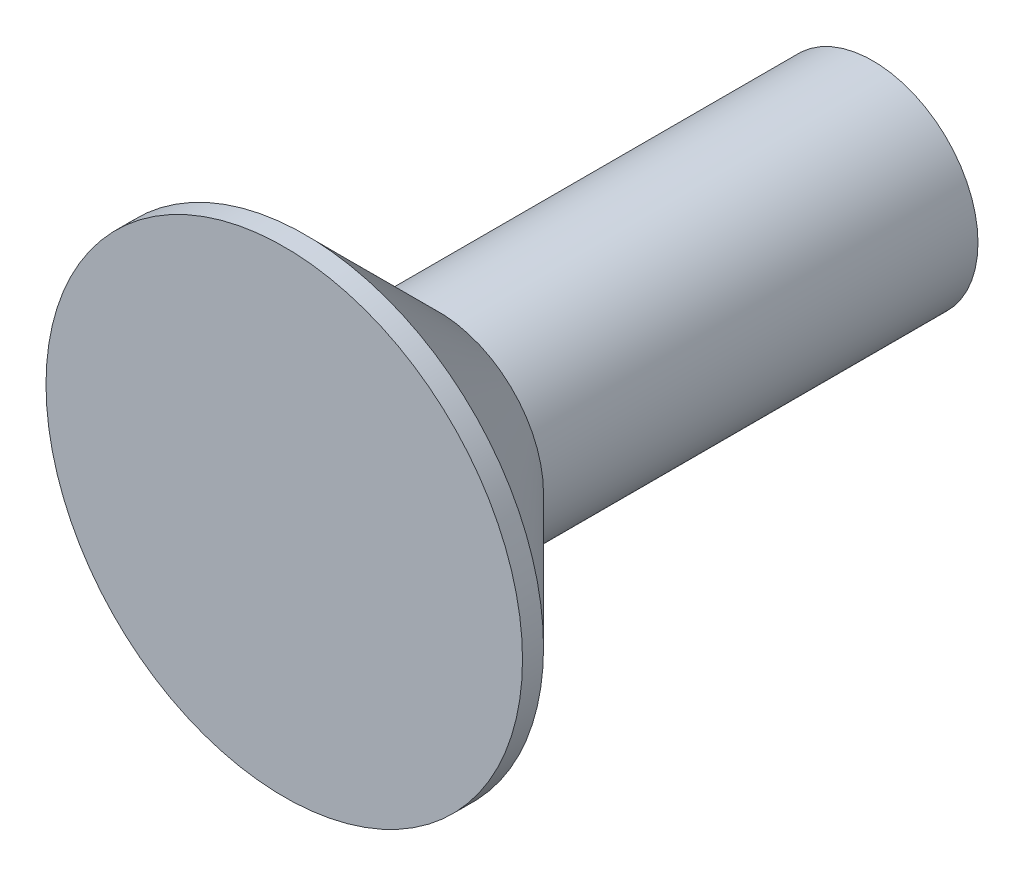
ISO-10303-21;
HEADER;
FILE_DESCRIPTION(('STEP AP214'),'2;1');
FILE_NAME('part.step','',(''),(''),'','','');
FILE_SCHEMA(('AUTOMOTIVE_DESIGN { 1 0 10303 214 1 1 1 1 }'));
ENDSEC;
DATA;
#1=APPLICATION_CONTEXT('core data for automotive mechanical design processes');
#2=APPLICATION_PROTOCOL_DEFINITION('international standard','automotive_design',2000,#1);
#3=PRODUCT_CONTEXT('',#1,'mechanical');
#4=PRODUCT('Part','Part','',(#3));
#5=PRODUCT_RELATED_PRODUCT_CATEGORY('part','',(#4));
#6=PRODUCT_DEFINITION_FORMATION('','',#4);
#7=PRODUCT_DEFINITION_CONTEXT('part definition',#1,'design');
#8=PRODUCT_DEFINITION('design','',#6,#7);
#9=PRODUCT_DEFINITION_SHAPE('','',#8);
#10=(LENGTH_UNIT() NAMED_UNIT(*) SI_UNIT(.MILLI.,.METRE.));
#11=(NAMED_UNIT(*) PLANE_ANGLE_UNIT() SI_UNIT($,.RADIAN.));
#12=(NAMED_UNIT(*) SI_UNIT($,.STERADIAN.) SOLID_ANGLE_UNIT());
#13=UNCERTAINTY_MEASURE_WITH_UNIT(LENGTH_MEASURE(1.E-05),#10,'distance_accuracy_value','');
#14=(GEOMETRIC_REPRESENTATION_CONTEXT(3) GLOBAL_UNCERTAINTY_ASSIGNED_CONTEXT((#13)) GLOBAL_UNIT_ASSIGNED_CONTEXT((#10,
#11,#12)) REPRESENTATION_CONTEXT('',''));
#15=CARTESIAN_POINT('',(0.,0.,0.));
#16=DIRECTION('',(0.,0.,1.));
#17=DIRECTION('',(1.,0.,0.));
#18=AXIS2_PLACEMENT_3D('',#15,#16,#17);
#19=CARTESIAN_POINT('',(26.0000000000011,91.0499999997167,167.910489149859));
#20=DIRECTION('',(0.,0.,1.));
#21=DIRECTION('',(-1.,0.,0.));
#22=AXIS2_PLACEMENT_3D('',#19,#20,#21);
#23=CONICAL_SURFACE('',#22,3.4,0.785398162500003);
#24=CARTESIAN_POINT('',(26.0000000000011,91.0499999997167,167.910489149859));
#25=DIRECTION('',(0.,0.,1.));
#26=DIRECTION('',(-1.,0.,0.));
#27=AXIS2_PLACEMENT_3D('',#24,#25,#26);
#28=CIRCLE('',#27,3.4);
#29=CARTESIAN_POINT('',(22.6000000000011,91.0499999997167,167.910489149859));
#30=VERTEX_POINT('',#29);
#31=EDGE_CURVE('E46',#30,#30,#28,.T.);
#32=ORIENTED_EDGE('',*,*,#31,.F.);
#33=EDGE_LOOP('',(#32));
#34=FACE_BOUND('',#33,.T.);
#35=CARTESIAN_POINT('',(26.0000000000011,91.0499999997167,166.010489149859));
#36=DIRECTION('',(0.,0.,-1.));
#37=DIRECTION('',(-1.,0.,0.));
#38=AXIS2_PLACEMENT_3D('',#35,#36,#37);
#39=CIRCLE('',#38,1.5);
#40=CARTESIAN_POINT('',(24.5000000000011,91.0499999997167,166.010489149859));
#41=VERTEX_POINT('',#40);
#42=EDGE_CURVE('E53',#41,#41,#39,.T.);
#43=ORIENTED_EDGE('',*,*,#42,.F.);
#44=EDGE_LOOP('',(#43));
#45=FACE_BOUND('',#44,.T.);
#46=ADVANCED_FACE('F42',(#34,#45),#23,.T.);
#47=CARTESIAN_POINT('',(26.0000000000011,91.0499999997167,159.810489149859));
#48=DIRECTION('',(0.,0.,1.));
#49=DIRECTION('',(1.,0.,0.));
#50=AXIS2_PLACEMENT_3D('',#47,#48,#49);
#51=PLANE('',#50);
#52=CARTESIAN_POINT('',(26.0000000000011,91.0499999997167,159.810489149859));
#53=DIRECTION('',(0.,0.,1.));
#54=DIRECTION('',(-1.,0.,0.));
#55=AXIS2_PLACEMENT_3D('',#52,#53,#54);
#56=CIRCLE('',#55,1.5);
#57=CARTESIAN_POINT('',(24.5000000000011,91.0499999997167,159.810489149859));
#58=VERTEX_POINT('',#57);
#59=EDGE_CURVE('E11',#58,#58,#56,.T.);
#60=ORIENTED_EDGE('',*,*,#59,.F.);
#61=EDGE_LOOP('',(#60));
#62=FACE_BOUND('',#61,.T.);
#63=ADVANCED_FACE('F44',(#62),#51,.F.);
#64=CARTESIAN_POINT('',(26.0000000000011,91.0499999997167,159.810489149859));
#65=DIRECTION('',(0.,0.,1.));
#66=DIRECTION('',(-1.,0.,0.));
#67=AXIS2_PLACEMENT_3D('',#64,#65,#66);
#68=CYLINDRICAL_SURFACE('',#67,1.5);
#69=ORIENTED_EDGE('',*,*,#59,.T.);
#70=EDGE_LOOP('',(#69));
#71=FACE_BOUND('',#70,.T.);
#72=ORIENTED_EDGE('',*,*,#42,.T.);
#73=EDGE_LOOP('',(#72));
#74=FACE_BOUND('',#73,.T.);
#75=ADVANCED_FACE('F87',(#71,#74),#68,.T.);
#76=CARTESIAN_POINT('',(26.0000000000011,91.0499999997167,168.210489149859));
#77=DIRECTION('',(0.,0.,1.));
#78=DIRECTION('',(1.,0.,0.));
#79=AXIS2_PLACEMENT_3D('',#76,#77,#78);
#80=PLANE('',#79);
#81=CARTESIAN_POINT('',(26.0000000000011,91.0499999997167,168.210489149859));
#82=DIRECTION('',(0.,0.,1.));
#83=DIRECTION('',(-1.,0.,0.));
#84=AXIS2_PLACEMENT_3D('',#81,#82,#83);
#85=CIRCLE('',#84,3.4);
#86=CARTESIAN_POINT('',(22.6000000000011,91.0499999997167,168.210489149859));
#87=VERTEX_POINT('',#86);
#88=EDGE_CURVE('E75',#87,#87,#85,.T.);
#89=ORIENTED_EDGE('',*,*,#88,.T.);
#90=EDGE_LOOP('',(#89));
#91=FACE_BOUND('',#90,.T.);
#92=ADVANCED_FACE('F76',(#91),#80,.T.);
#93=CARTESIAN_POINT('',(26.0000000000011,91.0499999997167,168.210489149859));
#94=DIRECTION('',(0.,0.,-1.));
#95=DIRECTION('',(1.,0.,0.));
#96=AXIS2_PLACEMENT_3D('',#93,#94,#95);
#97=CYLINDRICAL_SURFACE('',#96,3.4);
#98=ORIENTED_EDGE('',*,*,#31,.T.);
#99=EDGE_LOOP('',(#98));
#100=FACE_BOUND('',#99,.T.);
#101=ORIENTED_EDGE('',*,*,#88,.F.);
#102=EDGE_LOOP('',(#101));
#103=FACE_BOUND('',#102,.T.);
#104=ADVANCED_FACE('F99',(#100,#103),#97,.T.);
#105=CLOSED_SHELL('',(#46,#63,#75,#92,#104));
#106=MANIFOLD_SOLID_BREP('B2',#105);
#107=ADVANCED_BREP_SHAPE_REPRESENTATION('',(#18,#106),#14);
#108=SHAPE_DEFINITION_REPRESENTATION(#9,#107);
ENDSEC;
END-ISO-10303-21;
